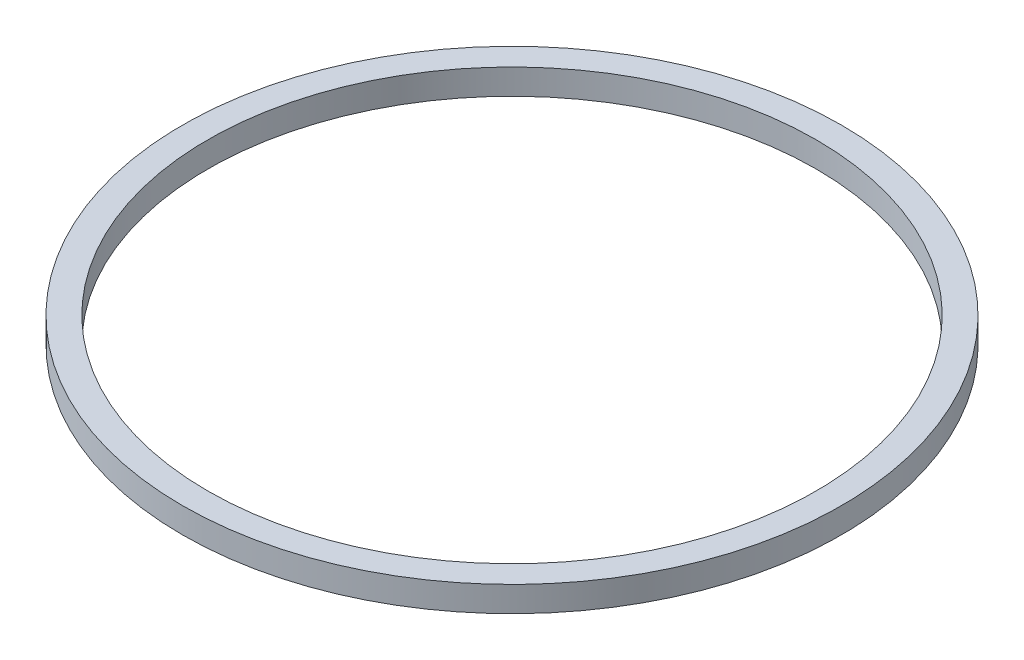
ISO-10303-21;
HEADER;
FILE_DESCRIPTION(('STEP AP214'),'2;1');
FILE_NAME('part.step','',(''),(''),'','','');
FILE_SCHEMA(('AUTOMOTIVE_DESIGN { 1 0 10303 214 1 1 1 1 }'));
ENDSEC;
DATA;
#1=APPLICATION_CONTEXT('core data for automotive mechanical design processes');
#2=APPLICATION_PROTOCOL_DEFINITION('international standard','automotive_design',2000,#1);
#3=PRODUCT_CONTEXT('',#1,'mechanical');
#4=PRODUCT('Part','Part','',(#3));
#5=PRODUCT_RELATED_PRODUCT_CATEGORY('part','',(#4));
#6=PRODUCT_DEFINITION_FORMATION('','',#4);
#7=PRODUCT_DEFINITION_CONTEXT('part definition',#1,'design');
#8=PRODUCT_DEFINITION('design','',#6,#7);
#9=PRODUCT_DEFINITION_SHAPE('','',#8);
#10=(LENGTH_UNIT() NAMED_UNIT(*) SI_UNIT(.MILLI.,.METRE.));
#11=(NAMED_UNIT(*) PLANE_ANGLE_UNIT() SI_UNIT($,.RADIAN.));
#12=(NAMED_UNIT(*) SI_UNIT($,.STERADIAN.) SOLID_ANGLE_UNIT());
#13=UNCERTAINTY_MEASURE_WITH_UNIT(LENGTH_MEASURE(1.E-05),#10,'distance_accuracy_value','');
#14=(GEOMETRIC_REPRESENTATION_CONTEXT(3) GLOBAL_UNCERTAINTY_ASSIGNED_CONTEXT((#13)) GLOBAL_UNIT_ASSIGNED_CONTEXT((#10,
#11,#12)) REPRESENTATION_CONTEXT('',''));
#15=CARTESIAN_POINT('',(0.,0.,0.));
#16=DIRECTION('',(0.,0.,1.));
#17=DIRECTION('',(1.,0.,0.));
#18=AXIS2_PLACEMENT_3D('',#15,#16,#17);
#19=CARTESIAN_POINT('',(0.,53.,0.));
#20=DIRECTION('',(0.,1.,0.));
#21=DIRECTION('',(0.,0.,1.));
#22=AXIS2_PLACEMENT_3D('',#19,#20,#21);
#23=PLANE('',#22);
#24=CARTESIAN_POINT('',(0.,53.,0.));
#25=DIRECTION('',(0.,1.,0.));
#26=DIRECTION('',(0.,0.,1.));
#27=AXIS2_PLACEMENT_3D('',#24,#25,#26);
#28=CIRCLE('',#27,60.);
#29=CARTESIAN_POINT('',(0.,53.,60.));
#30=VERTEX_POINT('',#29);
#31=EDGE_CURVE('E10',#30,#30,#28,.T.);
#32=ORIENTED_EDGE('',*,*,#31,.F.);
#33=EDGE_LOOP('',(#32));
#34=FACE_BOUND('',#33,.T.);
#35=CARTESIAN_POINT('',(0.,53.,0.));
#36=DIRECTION('',(0.,1.,0.));
#37=DIRECTION('',(0.,0.,1.));
#38=AXIS2_PLACEMENT_3D('',#35,#36,#37);
#39=CIRCLE('',#38,65.);
#40=CARTESIAN_POINT('',(0.,53.,65.));
#41=VERTEX_POINT('',#40);
#42=EDGE_CURVE('E55',#41,#41,#39,.T.);
#43=ORIENTED_EDGE('',*,*,#42,.T.);
#44=EDGE_LOOP('',(#43));
#45=FACE_BOUND('',#44,.T.);
#46=ADVANCED_FACE('F40',(#34,#45),#23,.T.);
#47=CARTESIAN_POINT('',(0.,48.,0.));
#48=DIRECTION('',(0.,-1.,0.));
#49=DIRECTION('',(0.,0.,-1.));
#50=AXIS2_PLACEMENT_3D('',#47,#48,#49);
#51=PLANE('',#50);
#52=CARTESIAN_POINT('',(0.,48.,0.));
#53=DIRECTION('',(0.,-1.,0.));
#54=DIRECTION('',(0.,0.,-1.));
#55=AXIS2_PLACEMENT_3D('',#52,#53,#54);
#56=CIRCLE('',#55,60.);
#57=CARTESIAN_POINT('',(0.,48.,60.));
#58=VERTEX_POINT('',#57);
#59=EDGE_CURVE('E48',#58,#58,#56,.F.);
#60=ORIENTED_EDGE('',*,*,#59,.T.);
#61=EDGE_LOOP('',(#60));
#62=FACE_BOUND('',#61,.T.);
#63=CARTESIAN_POINT('',(0.,48.,0.));
#64=DIRECTION('',(0.,-1.,0.));
#65=DIRECTION('',(0.,0.,-1.));
#66=AXIS2_PLACEMENT_3D('',#63,#64,#65);
#67=CIRCLE('',#66,65.);
#68=CARTESIAN_POINT('',(0.,48.,-65.));
#69=VERTEX_POINT('',#68);
#70=EDGE_CURVE('E43',#69,#69,#67,.T.);
#71=ORIENTED_EDGE('',*,*,#70,.T.);
#72=EDGE_LOOP('',(#71));
#73=FACE_BOUND('',#72,.T.);
#74=ADVANCED_FACE('F64',(#62,#73),#51,.T.);
#75=CARTESIAN_POINT('',(0.,-176.211009871688,0.));
#76=DIRECTION('',(0.,1.,0.));
#77=DIRECTION('',(0.,0.,1.));
#78=AXIS2_PLACEMENT_3D('',#75,#76,#77);
#79=CYLINDRICAL_SURFACE('',#78,60.);
#80=CARTESIAN_POINT('',(0.,53.,60.));
#81=CARTESIAN_POINT('',(0.,52.9479166666667,60.));
#82=CARTESIAN_POINT('',(0.,52.8958333333334,60.));
#83=CARTESIAN_POINT('',(0.,52.7916666666667,60.));
#84=CARTESIAN_POINT('',(0.,52.7395833333334,60.));
#85=CARTESIAN_POINT('',(0.,52.6354166666667,60.));
#86=CARTESIAN_POINT('',(0.,52.5833333333334,60.));
#87=CARTESIAN_POINT('',(0.,52.4791666666667,60.));
#88=CARTESIAN_POINT('',(0.,52.4270833333334,60.));
#89=CARTESIAN_POINT('',(0.,52.3229166666667,60.));
#90=CARTESIAN_POINT('',(0.,52.2708333333333,60.));
#91=CARTESIAN_POINT('',(0.,52.1666666666667,60.));
#92=CARTESIAN_POINT('',(0.,52.1145833333333,60.));
#93=CARTESIAN_POINT('',(0.,52.0104166666667,60.));
#94=CARTESIAN_POINT('',(0.,51.9583333333333,60.));
#95=CARTESIAN_POINT('',(0.,51.8541666666667,60.));
#96=CARTESIAN_POINT('',(0.,51.8020833333333,60.));
#97=CARTESIAN_POINT('',(0.,51.6979166666667,60.));
#98=CARTESIAN_POINT('',(0.,51.6458333333334,60.));
#99=CARTESIAN_POINT('',(0.,51.5416666666667,60.));
#100=CARTESIAN_POINT('',(0.,51.4895833333334,60.));
#101=CARTESIAN_POINT('',(0.,51.3854166666667,60.));
#102=CARTESIAN_POINT('',(0.,51.3333333333334,60.));
#103=CARTESIAN_POINT('',(0.,51.2291666666667,60.));
#104=CARTESIAN_POINT('',(0.,51.1770833333333,60.));
#105=CARTESIAN_POINT('',(0.,51.0729166666667,60.));
#106=CARTESIAN_POINT('',(0.,51.0208333333333,60.));
#107=CARTESIAN_POINT('',(0.,50.9166666666667,60.));
#108=CARTESIAN_POINT('',(0.,50.8645833333333,60.));
#109=CARTESIAN_POINT('',(0.,50.7604166666667,60.));
#110=CARTESIAN_POINT('',(0.,50.7083333333333,60.));
#111=CARTESIAN_POINT('',(0.,50.6041666666667,60.));
#112=CARTESIAN_POINT('',(0.,50.5520833333333,60.));
#113=CARTESIAN_POINT('',(0.,50.4479166666667,60.));
#114=CARTESIAN_POINT('',(0.,50.3958333333334,60.));
#115=CARTESIAN_POINT('',(0.,50.2916666666667,60.));
#116=CARTESIAN_POINT('',(0.,50.2395833333334,60.));
#117=CARTESIAN_POINT('',(0.,50.1354166666667,60.));
#118=CARTESIAN_POINT('',(0.,50.0833333333334,60.));
#119=CARTESIAN_POINT('',(0.,49.9791666666667,60.));
#120=CARTESIAN_POINT('',(0.,49.9270833333334,60.));
#121=CARTESIAN_POINT('',(0.,49.8229166666667,60.));
#122=CARTESIAN_POINT('',(0.,49.7708333333333,60.));
#123=CARTESIAN_POINT('',(0.,49.6666666666667,60.));
#124=CARTESIAN_POINT('',(0.,49.6145833333333,60.));
#125=CARTESIAN_POINT('',(0.,49.5104166666667,60.));
#126=CARTESIAN_POINT('',(0.,49.4583333333333,60.));
#127=CARTESIAN_POINT('',(0.,49.3541666666667,60.));
#128=CARTESIAN_POINT('',(0.,49.3020833333333,60.));
#129=CARTESIAN_POINT('',(0.,49.1979166666667,60.));
#130=CARTESIAN_POINT('',(0.,49.1458333333334,60.));
#131=CARTESIAN_POINT('',(0.,49.0416666666667,60.));
#132=CARTESIAN_POINT('',(0.,48.9895833333334,60.));
#133=CARTESIAN_POINT('',(0.,48.8854166666667,60.));
#134=CARTESIAN_POINT('',(0.,48.8333333333334,60.));
#135=CARTESIAN_POINT('',(0.,48.7291666666667,60.));
#136=CARTESIAN_POINT('',(0.,48.6770833333333,60.));
#137=CARTESIAN_POINT('',(0.,48.5729166666667,60.));
#138=CARTESIAN_POINT('',(0.,48.5208333333333,60.));
#139=CARTESIAN_POINT('',(0.,48.4166666666667,60.));
#140=CARTESIAN_POINT('',(0.,48.3645833333333,60.));
#141=CARTESIAN_POINT('',(0.,48.2604166666667,60.));
#142=CARTESIAN_POINT('',(0.,48.2083333333333,60.));
#143=CARTESIAN_POINT('',(0.,48.1041666666667,60.));
#144=CARTESIAN_POINT('',(0.,48.0520833333333,60.));
#145=CARTESIAN_POINT('',(0.,48.,60.));
#146=B_SPLINE_CURVE_WITH_KNOTS('',3,(#80,#81,#82,#83,#84,#85,#86,#87,#88,#89,#90,#91,#92,#93,
#94,#95,#96,#97,#98,#99,#100,#101,#102,#103,#104,#105,#106,#107,#108,#109,#110,#111,#112,#113,
#114,#115,#116,#117,#118,#119,#120,#121,#122,#123,#124,#125,#126,#127,#128,#129,#130,#131,#132,
#133,#134,#135,#136,#137,#138,#139,#140,#141,#142,#143,#144,#145),.UNSPECIFIED.,.F.,.F.,(4,2,2,
2,2,2,2,2,2,2,2,2,2,2,2,2,2,2,2,2,2,2,2,2,2,2,2,2,2,2,2,2,4),(0.,0.156249999999997,
0.312499999999993,0.46874999999999,0.624999999999987,0.781250000000011,0.937500000000008,
1.09375,1.25,1.40625,1.56249999999999,1.71874999999999,1.87500000000002,2.03125000000001,
2.18750000000001,2.34375000000001,2.5,2.65625,2.8125,2.96874999999999,3.12499999999999,
3.28125000000001,3.43750000000001,3.59375000000001,3.75,3.90625,4.0625,4.21874999999999,
4.37500000000002,4.53125000000001,4.68750000000001,4.84375000000001,5.),.UNSPECIFIED.);
#147=EDGE_CURVE('BSEAM69',#30,#58,#146,.T.);
#148=ORIENTED_EDGE('',*,*,#31,.T.);
#149=ORIENTED_EDGE('',*,*,#59,.F.);
#150=ORIENTED_EDGE('',*,*,#147,.T.);
#151=ORIENTED_EDGE('',*,*,#147,.F.);
#152=EDGE_LOOP('',(#148,#150,#149,#151));
#153=FACE_BOUND('',#152,.T.);
#154=ADVANCED_FACE('F69',(#153),#79,.F.);
#155=CARTESIAN_POINT('',(0.,3.,0.));
#156=DIRECTION('',(0.,1.,0.));
#157=DIRECTION('',(0.,0.,1.));
#158=AXIS2_PLACEMENT_3D('',#155,#156,#157);
#159=CYLINDRICAL_SURFACE('',#158,65.);
#160=ORIENTED_EDGE('',*,*,#70,.F.);
#161=EDGE_LOOP('',(#160));
#162=FACE_BOUND('',#161,.T.);
#163=ORIENTED_EDGE('',*,*,#42,.F.);
#164=EDGE_LOOP('',(#163));
#165=FACE_BOUND('',#164,.T.);
#166=ADVANCED_FACE('F66',(#162,#165),#159,.T.);
#167=CLOSED_SHELL('',(#46,#74,#154,#166));
#168=MANIFOLD_SOLID_BREP('B2',#167);
#169=ADVANCED_BREP_SHAPE_REPRESENTATION('',(#18,#168),#14);
#170=SHAPE_DEFINITION_REPRESENTATION(#9,#169);
ENDSEC;
END-ISO-10303-21;
